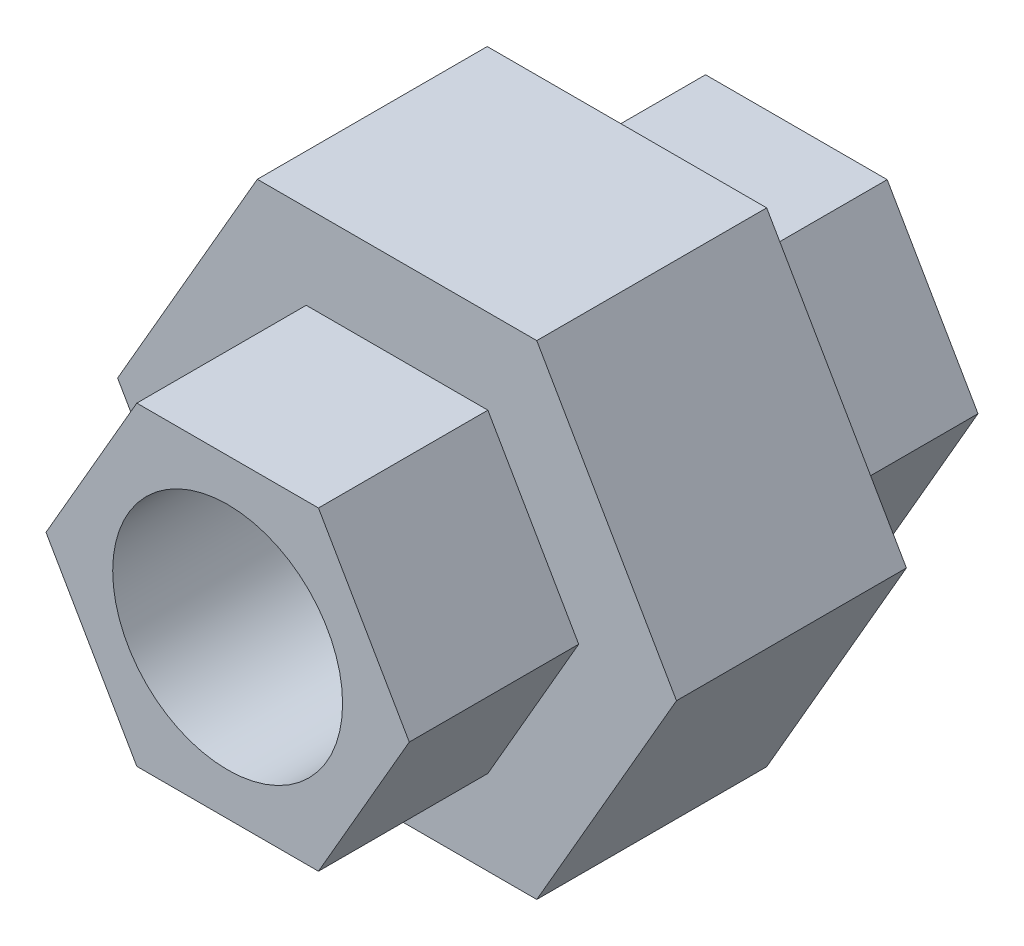
ISO-10303-21;
HEADER;
FILE_DESCRIPTION(('STEP AP214'),'2;1');
FILE_NAME('part.step','',(''),(''),'','','');
FILE_SCHEMA(('AUTOMOTIVE_DESIGN { 1 0 10303 214 1 1 1 1 }'));
ENDSEC;
DATA;
#1=APPLICATION_CONTEXT('core data for automotive mechanical design processes');
#2=APPLICATION_PROTOCOL_DEFINITION('international standard','automotive_design',2000,#1);
#3=PRODUCT_CONTEXT('',#1,'mechanical');
#4=PRODUCT('Part','Part','',(#3));
#5=PRODUCT_RELATED_PRODUCT_CATEGORY('part','',(#4));
#6=PRODUCT_DEFINITION_FORMATION('','',#4);
#7=PRODUCT_DEFINITION_CONTEXT('part definition',#1,'design');
#8=PRODUCT_DEFINITION('design','',#6,#7);
#9=PRODUCT_DEFINITION_SHAPE('','',#8);
#10=(LENGTH_UNIT() NAMED_UNIT(*) SI_UNIT(.MILLI.,.METRE.));
#11=(NAMED_UNIT(*) PLANE_ANGLE_UNIT() SI_UNIT($,.RADIAN.));
#12=(NAMED_UNIT(*) SI_UNIT($,.STERADIAN.) SOLID_ANGLE_UNIT());
#13=UNCERTAINTY_MEASURE_WITH_UNIT(LENGTH_MEASURE(1.E-05),#10,'distance_accuracy_value','');
#14=(GEOMETRIC_REPRESENTATION_CONTEXT(3) GLOBAL_UNCERTAINTY_ASSIGNED_CONTEXT((#13)) GLOBAL_UNIT_ASSIGNED_CONTEXT((#10,
#11,#12)) REPRESENTATION_CONTEXT('',''));
#15=CARTESIAN_POINT('',(0.,0.,0.));
#16=DIRECTION('',(0.,0.,1.));
#17=DIRECTION('',(1.,0.,0.));
#18=AXIS2_PLACEMENT_3D('',#15,#16,#17);
#19=CARTESIAN_POINT('',(-11.5470053837925,-20.,0.));
#20=DIRECTION('',(0.,0.,-1.));
#21=DIRECTION('',(-1.,0.,0.));
#22=AXIS2_PLACEMENT_3D('',#19,#20,#21);
#23=PLANE('',#22);
#24=DIRECTION('',(1.,0.,0.));
#25=VECTOR('',#24,1.);
#26=CARTESIAN_POINT('',(-11.5470053837925,-20.,0.));
#27=LINE('',#26,#25);
#28=CARTESIAN_POINT('',(-11.5470053837925,-20.,0.));
#29=VERTEX_POINT('',#28);
#30=CARTESIAN_POINT('',(11.5470053837925,-20.,0.));
#31=VERTEX_POINT('',#30);
#32=EDGE_CURVE('E243',#29,#31,#27,.T.);
#33=ORIENTED_EDGE('',*,*,#32,.F.);
#34=DIRECTION('',(0.5,-0.866025403784439,0.));
#35=VECTOR('',#34,1.);
#36=CARTESIAN_POINT('',(-23.094010767585,0.,0.));
#37=LINE('',#36,#35);
#38=CARTESIAN_POINT('',(-23.094010767585,0.,0.));
#39=VERTEX_POINT('',#38);
#40=EDGE_CURVE('E248',#39,#29,#37,.T.);
#41=ORIENTED_EDGE('',*,*,#40,.F.);
#42=DIRECTION('',(-0.5,-0.866025403784439,0.));
#43=VECTOR('',#42,1.);
#44=CARTESIAN_POINT('',(-11.5470053837925,20.,0.));
#45=LINE('',#44,#43);
#46=CARTESIAN_POINT('',(-11.5470053837925,20.,0.));
#47=VERTEX_POINT('',#46);
#48=EDGE_CURVE('E267',#47,#39,#45,.T.);
#49=ORIENTED_EDGE('',*,*,#48,.F.);
#50=DIRECTION('',(-1.,0.,0.));
#51=VECTOR('',#50,1.);
#52=CARTESIAN_POINT('',(11.5470053837925,20.,0.));
#53=LINE('',#52,#51);
#54=CARTESIAN_POINT('',(11.5470053837925,20.,0.));
#55=VERTEX_POINT('',#54);
#56=EDGE_CURVE('E265',#55,#47,#53,.T.);
#57=ORIENTED_EDGE('',*,*,#56,.F.);
#58=DIRECTION('',(-0.5,0.866025403784439,0.));
#59=VECTOR('',#58,1.);
#60=CARTESIAN_POINT('',(23.094010767585,0.,0.));
#61=LINE('',#60,#59);
#62=CARTESIAN_POINT('',(23.094010767585,0.,0.));
#63=VERTEX_POINT('',#62);
#64=EDGE_CURVE('E263',#63,#55,#61,.T.);
#65=ORIENTED_EDGE('',*,*,#64,.F.);
#66=DIRECTION('',(0.5,0.866025403784439,0.));
#67=VECTOR('',#66,1.);
#68=CARTESIAN_POINT('',(11.5470053837925,-20.,0.));
#69=LINE('',#68,#67);
#70=EDGE_CURVE('E261',#31,#63,#69,.T.);
#71=ORIENTED_EDGE('',*,*,#70,.F.);
#72=EDGE_LOOP('',(#33,#41,#49,#57,#65,#71));
#73=FACE_BOUND('',#72,.T.);
#74=DIRECTION('',(-0.5,0.866025403784439,0.));
#75=VECTOR('',#74,1.);
#76=CARTESIAN_POINT('',(-7.50555349946513,-13.,0.));
#77=LINE('',#76,#75);
#78=CARTESIAN_POINT('',(-7.50555349946513,-13.,0.));
#79=VERTEX_POINT('',#78);
#80=CARTESIAN_POINT('',(-15.0111069989303,0.,0.));
#81=VERTEX_POINT('',#80);
#82=EDGE_CURVE('E398',#79,#81,#77,.T.);
#83=ORIENTED_EDGE('',*,*,#82,.F.);
#84=DIRECTION('',(-1.,0.,0.));
#85=VECTOR('',#84,1.);
#86=CARTESIAN_POINT('',(7.50555349946514,-13.,0.));
#87=LINE('',#86,#85);
#88=CARTESIAN_POINT('',(7.50555349946514,-13.,0.));
#89=VERTEX_POINT('',#88);
#90=EDGE_CURVE('E190',#89,#79,#87,.T.);
#91=ORIENTED_EDGE('',*,*,#90,.F.);
#92=DIRECTION('',(-0.5,-0.866025403784439,0.));
#93=VECTOR('',#92,1.);
#94=CARTESIAN_POINT('',(15.0111069989303,0.,0.));
#95=LINE('',#94,#93);
#96=CARTESIAN_POINT('',(15.0111069989303,0.,0.));
#97=VERTEX_POINT('',#96);
#98=EDGE_CURVE('E186',#97,#89,#95,.T.);
#99=ORIENTED_EDGE('',*,*,#98,.F.);
#100=DIRECTION('',(0.5,-0.866025403784439,0.));
#101=VECTOR('',#100,1.);
#102=CARTESIAN_POINT('',(7.50555349946513,13.,0.));
#103=LINE('',#102,#101);
#104=CARTESIAN_POINT('',(7.50555349946513,13.,0.));
#105=VERTEX_POINT('',#104);
#106=EDGE_CURVE('E404',#105,#97,#103,.T.);
#107=ORIENTED_EDGE('',*,*,#106,.F.);
#108=DIRECTION('',(1.,0.,0.));
#109=VECTOR('',#108,1.);
#110=CARTESIAN_POINT('',(-7.50555349946514,13.,0.));
#111=LINE('',#110,#109);
#112=CARTESIAN_POINT('',(-7.50555349946514,13.,0.));
#113=VERTEX_POINT('',#112);
#114=EDGE_CURVE('E402',#113,#105,#111,.T.);
#115=ORIENTED_EDGE('',*,*,#114,.F.);
#116=DIRECTION('',(0.5,0.866025403784439,0.));
#117=VECTOR('',#116,1.);
#118=CARTESIAN_POINT('',(-15.0111069989303,0.,0.));
#119=LINE('',#118,#117);
#120=EDGE_CURVE('E400',#81,#113,#119,.T.);
#121=ORIENTED_EDGE('',*,*,#120,.F.);
#122=EDGE_LOOP('',(#83,#91,#99,#107,#115,#121));
#123=FACE_BOUND('',#122,.T.);
#124=ADVANCED_FACE('F42',(#73,#123),#23,.T.);
#125=CARTESIAN_POINT('',(-11.5470053837925,-20.,19.));
#126=DIRECTION('',(0.,0.,-1.));
#127=DIRECTION('',(-1.,0.,0.));
#128=AXIS2_PLACEMENT_3D('',#125,#126,#127);
#129=PLANE('',#128);
#130=DIRECTION('',(1.,0.,0.));
#131=VECTOR('',#130,1.);
#132=CARTESIAN_POINT('',(-11.5470053837925,-20.,19.));
#133=LINE('',#132,#131);
#134=CARTESIAN_POINT('',(-11.5470053837925,-20.,19.));
#135=VERTEX_POINT('',#134);
#136=CARTESIAN_POINT('',(11.5470053837925,-20.,19.));
#137=VERTEX_POINT('',#136);
#138=EDGE_CURVE('E244',#135,#137,#133,.T.);
#139=ORIENTED_EDGE('',*,*,#138,.T.);
#140=DIRECTION('',(0.5,0.866025403784439,0.));
#141=VECTOR('',#140,1.);
#142=CARTESIAN_POINT('',(11.5470053837925,-20.,19.));
#143=LINE('',#142,#141);
#144=CARTESIAN_POINT('',(23.094010767585,0.,19.));
#145=VERTEX_POINT('',#144);
#146=EDGE_CURVE('E247',#137,#145,#143,.T.);
#147=ORIENTED_EDGE('',*,*,#146,.T.);
#148=DIRECTION('',(-0.5,0.866025403784439,0.));
#149=VECTOR('',#148,1.);
#150=CARTESIAN_POINT('',(23.094010767585,0.,19.));
#151=LINE('',#150,#149);
#152=CARTESIAN_POINT('',(11.5470053837925,20.,19.));
#153=VERTEX_POINT('',#152);
#154=EDGE_CURVE('E250',#145,#153,#151,.T.);
#155=ORIENTED_EDGE('',*,*,#154,.T.);
#156=DIRECTION('',(-1.,0.,0.));
#157=VECTOR('',#156,1.);
#158=CARTESIAN_POINT('',(11.5470053837925,20.,19.));
#159=LINE('',#158,#157);
#160=CARTESIAN_POINT('',(-11.5470053837925,20.,19.));
#161=VERTEX_POINT('',#160);
#162=EDGE_CURVE('E252',#153,#161,#159,.T.);
#163=ORIENTED_EDGE('',*,*,#162,.T.);
#164=DIRECTION('',(-0.5,-0.866025403784439,0.));
#165=VECTOR('',#164,1.);
#166=CARTESIAN_POINT('',(-11.5470053837925,20.,19.));
#167=LINE('',#166,#165);
#168=CARTESIAN_POINT('',(-23.094010767585,0.,19.));
#169=VERTEX_POINT('',#168);
#170=EDGE_CURVE('E254',#161,#169,#167,.T.);
#171=ORIENTED_EDGE('',*,*,#170,.T.);
#172=DIRECTION('',(0.5,-0.866025403784439,0.));
#173=VECTOR('',#172,1.);
#174=CARTESIAN_POINT('',(-23.094010767585,0.,19.));
#175=LINE('',#174,#173);
#176=EDGE_CURVE('E256',#169,#135,#175,.T.);
#177=ORIENTED_EDGE('',*,*,#176,.T.);
#178=EDGE_LOOP('',(#139,#147,#155,#163,#171,#177));
#179=FACE_BOUND('',#178,.T.);
#180=DIRECTION('',(1.,0.,0.));
#181=VECTOR('',#180,1.);
#182=CARTESIAN_POINT('',(-7.50555349946514,-13.,19.));
#183=LINE('',#182,#181);
#184=CARTESIAN_POINT('',(-7.50555349946514,-13.,19.));
#185=VERTEX_POINT('',#184);
#186=CARTESIAN_POINT('',(7.50555349946513,-13.,19.));
#187=VERTEX_POINT('',#186);
#188=EDGE_CURVE('E192',#185,#187,#183,.T.);
#189=ORIENTED_EDGE('',*,*,#188,.F.);
#190=DIRECTION('',(0.5,-0.866025403784439,0.));
#191=VECTOR('',#190,1.);
#192=CARTESIAN_POINT('',(-15.0111069989303,0.,19.));
#193=LINE('',#192,#191);
#194=CARTESIAN_POINT('',(-15.0111069989303,0.,19.));
#195=VERTEX_POINT('',#194);
#196=EDGE_CURVE('E204',#195,#185,#193,.T.);
#197=ORIENTED_EDGE('',*,*,#196,.F.);
#198=DIRECTION('',(-0.5,-0.866025403784439,0.));
#199=VECTOR('',#198,1.);
#200=CARTESIAN_POINT('',(-7.50555349946514,13.,19.));
#201=LINE('',#200,#199);
#202=CARTESIAN_POINT('',(-7.50555349946513,13.,19.));
#203=VERTEX_POINT('',#202);
#204=EDGE_CURVE('E222',#203,#195,#201,.T.);
#205=ORIENTED_EDGE('',*,*,#204,.F.);
#206=DIRECTION('',(-1.,0.,0.));
#207=VECTOR('',#206,1.);
#208=CARTESIAN_POINT('',(7.50555349946514,13.,19.));
#209=LINE('',#208,#207);
#210=CARTESIAN_POINT('',(7.50555349946514,13.,19.));
#211=VERTEX_POINT('',#210);
#212=EDGE_CURVE('E219',#211,#203,#209,.T.);
#213=ORIENTED_EDGE('',*,*,#212,.F.);
#214=DIRECTION('',(-0.5,0.866025403784439,0.));
#215=VECTOR('',#214,1.);
#216=CARTESIAN_POINT('',(15.0111069989303,0.,19.));
#217=LINE('',#216,#215);
#218=CARTESIAN_POINT('',(15.0111069989303,0.,19.));
#219=VERTEX_POINT('',#218);
#220=EDGE_CURVE('E216',#219,#211,#217,.T.);
#221=ORIENTED_EDGE('',*,*,#220,.F.);
#222=DIRECTION('',(0.5,0.866025403784439,0.));
#223=VECTOR('',#222,1.);
#224=CARTESIAN_POINT('',(7.50555349946513,-13.,19.));
#225=LINE('',#224,#223);
#226=EDGE_CURVE('E65',#187,#219,#225,.T.);
#227=ORIENTED_EDGE('',*,*,#226,.F.);
#228=EDGE_LOOP('',(#189,#197,#205,#213,#221,#227));
#229=FACE_BOUND('',#228,.T.);
#230=ADVANCED_FACE('F304',(#179,#229),#129,.F.);
#231=CARTESIAN_POINT('',(-11.5470053837925,-20.,19.));
#232=DIRECTION('',(0.,1.,0.));
#233=DIRECTION('',(-1.,0.,0.));
#234=AXIS2_PLACEMENT_3D('',#231,#232,#233);
#235=PLANE('',#234);
#236=ORIENTED_EDGE('',*,*,#32,.T.);
#237=DIRECTION('',(0.,0.,-1.));
#238=VECTOR('',#237,1.);
#239=CARTESIAN_POINT('',(11.5470053837925,-20.,19.));
#240=LINE('',#239,#238);
#241=EDGE_CURVE('E11',#137,#31,#240,.T.);
#242=ORIENTED_EDGE('',*,*,#241,.F.);
#243=ORIENTED_EDGE('',*,*,#138,.F.);
#244=DIRECTION('',(0.,0.,-1.));
#245=VECTOR('',#244,1.);
#246=CARTESIAN_POINT('',(-11.5470053837925,-20.,19.));
#247=LINE('',#246,#245);
#248=EDGE_CURVE('E258',#135,#29,#247,.T.);
#249=ORIENTED_EDGE('',*,*,#248,.T.);
#250=EDGE_LOOP('',(#236,#242,#243,#249));
#251=FACE_BOUND('',#250,.T.);
#252=ADVANCED_FACE('F44',(#251),#235,.F.);
#253=CARTESIAN_POINT('',(11.5470053837925,-20.,19.));
#254=DIRECTION('',(-0.866025403784439,0.5,0.));
#255=DIRECTION('',(-0.5,-0.866025403784439,0.));
#256=AXIS2_PLACEMENT_3D('',#253,#254,#255);
#257=PLANE('',#256);
#258=ORIENTED_EDGE('',*,*,#70,.T.);
#259=DIRECTION('',(0.,0.,-1.));
#260=VECTOR('',#259,1.);
#261=CARTESIAN_POINT('',(23.094010767585,0.,19.));
#262=LINE('',#261,#260);
#263=EDGE_CURVE('E50',#145,#63,#262,.T.);
#264=ORIENTED_EDGE('',*,*,#263,.F.);
#265=ORIENTED_EDGE('',*,*,#146,.F.);
#266=ORIENTED_EDGE('',*,*,#241,.T.);
#267=EDGE_LOOP('',(#258,#264,#265,#266));
#268=FACE_BOUND('',#267,.T.);
#269=ADVANCED_FACE('F308',(#268),#257,.F.);
#270=CARTESIAN_POINT('',(23.094010767585,0.,19.));
#271=DIRECTION('',(-0.866025403784439,-0.5,0.));
#272=DIRECTION('',(0.5,-0.866025403784439,0.));
#273=AXIS2_PLACEMENT_3D('',#270,#271,#272);
#274=PLANE('',#273);
#275=ORIENTED_EDGE('',*,*,#64,.T.);
#276=DIRECTION('',(0.,0.,-1.));
#277=VECTOR('',#276,1.);
#278=CARTESIAN_POINT('',(11.5470053837925,20.,19.));
#279=LINE('',#278,#277);
#280=EDGE_CURVE('E278',#153,#55,#279,.T.);
#281=ORIENTED_EDGE('',*,*,#280,.F.);
#282=ORIENTED_EDGE('',*,*,#154,.F.);
#283=ORIENTED_EDGE('',*,*,#263,.T.);
#284=EDGE_LOOP('',(#275,#281,#282,#283));
#285=FACE_BOUND('',#284,.T.);
#286=ADVANCED_FACE('F285',(#285),#274,.F.);
#287=CARTESIAN_POINT('',(11.5470053837925,20.,19.));
#288=DIRECTION('',(0.,-1.,0.));
#289=DIRECTION('',(1.,0.,0.));
#290=AXIS2_PLACEMENT_3D('',#287,#288,#289);
#291=PLANE('',#290);
#292=ORIENTED_EDGE('',*,*,#56,.T.);
#293=DIRECTION('',(0.,0.,-1.));
#294=VECTOR('',#293,1.);
#295=CARTESIAN_POINT('',(-11.5470053837925,20.,19.));
#296=LINE('',#295,#294);
#297=EDGE_CURVE('E275',#161,#47,#296,.T.);
#298=ORIENTED_EDGE('',*,*,#297,.F.);
#299=ORIENTED_EDGE('',*,*,#162,.F.);
#300=ORIENTED_EDGE('',*,*,#280,.T.);
#301=EDGE_LOOP('',(#292,#298,#299,#300));
#302=FACE_BOUND('',#301,.T.);
#303=ADVANCED_FACE('F296',(#302),#291,.F.);
#304=CARTESIAN_POINT('',(-11.5470053837925,20.,19.));
#305=DIRECTION('',(0.866025403784439,-0.5,0.));
#306=DIRECTION('',(0.5,0.866025403784439,0.));
#307=AXIS2_PLACEMENT_3D('',#304,#305,#306);
#308=PLANE('',#307);
#309=ORIENTED_EDGE('',*,*,#48,.T.);
#310=DIRECTION('',(0.,0.,-1.));
#311=VECTOR('',#310,1.);
#312=CARTESIAN_POINT('',(-23.094010767585,0.,19.));
#313=LINE('',#312,#311);
#314=EDGE_CURVE('E272',#169,#39,#313,.T.);
#315=ORIENTED_EDGE('',*,*,#314,.F.);
#316=ORIENTED_EDGE('',*,*,#170,.F.);
#317=ORIENTED_EDGE('',*,*,#297,.T.);
#318=EDGE_LOOP('',(#309,#315,#316,#317));
#319=FACE_BOUND('',#318,.T.);
#320=ADVANCED_FACE('F300',(#319),#308,.F.);
#321=CARTESIAN_POINT('',(-23.094010767585,0.,19.));
#322=DIRECTION('',(0.866025403784439,0.5,0.));
#323=DIRECTION('',(-0.5,0.866025403784439,0.));
#324=AXIS2_PLACEMENT_3D('',#321,#322,#323);
#325=PLANE('',#324);
#326=ORIENTED_EDGE('',*,*,#40,.T.);
#327=ORIENTED_EDGE('',*,*,#248,.F.);
#328=ORIENTED_EDGE('',*,*,#176,.F.);
#329=ORIENTED_EDGE('',*,*,#314,.T.);
#330=EDGE_LOOP('',(#326,#327,#328,#329));
#331=FACE_BOUND('',#330,.T.);
#332=ADVANCED_FACE('F311',(#331),#325,.F.);
#333=CARTESIAN_POINT('',(-7.50555349946514,-13.,33.));
#334=DIRECTION('',(0.,1.,0.));
#335=DIRECTION('',(-1.,0.,0.));
#336=AXIS2_PLACEMENT_3D('',#333,#334,#335);
#337=PLANE('',#336);
#338=ORIENTED_EDGE('',*,*,#188,.T.);
#339=DIRECTION('',(0.,0.,-1.));
#340=VECTOR('',#339,1.);
#341=CARTESIAN_POINT('',(7.50555349946513,-13.,33.));
#342=LINE('',#341,#340);
#343=CARTESIAN_POINT('',(7.50555349946513,-13.,33.));
#344=VERTEX_POINT('',#343);
#345=EDGE_CURVE('E241',#344,#187,#342,.T.);
#346=ORIENTED_EDGE('',*,*,#345,.F.);
#347=DIRECTION('',(1.,0.,0.));
#348=VECTOR('',#347,1.);
#349=CARTESIAN_POINT('',(-7.50555349946514,-13.,33.));
#350=LINE('',#349,#348);
#351=CARTESIAN_POINT('',(-7.50555349946514,-13.,33.));
#352=VERTEX_POINT('',#351);
#353=EDGE_CURVE('E200',#352,#344,#350,.T.);
#354=ORIENTED_EDGE('',*,*,#353,.F.);
#355=DIRECTION('',(0.,0.,-1.));
#356=VECTOR('',#355,1.);
#357=CARTESIAN_POINT('',(-7.50555349946514,-13.,33.));
#358=LINE('',#357,#356);
#359=EDGE_CURVE('E213',#352,#185,#358,.T.);
#360=ORIENTED_EDGE('',*,*,#359,.T.);
#361=EDGE_LOOP('',(#338,#346,#354,#360));
#362=FACE_BOUND('',#361,.T.);
#363=ADVANCED_FACE('F313',(#362),#337,.F.);
#364=CARTESIAN_POINT('',(7.50555349946513,-13.,33.));
#365=DIRECTION('',(-0.866025403784439,0.5,0.));
#366=DIRECTION('',(-0.5,-0.866025403784439,0.));
#367=AXIS2_PLACEMENT_3D('',#364,#365,#366);
#368=PLANE('',#367);
#369=ORIENTED_EDGE('',*,*,#226,.T.);
#370=DIRECTION('',(0.,0.,-1.));
#371=VECTOR('',#370,1.);
#372=CARTESIAN_POINT('',(15.0111069989303,0.,33.));
#373=LINE('',#372,#371);
#374=CARTESIAN_POINT('',(15.0111069989303,0.,33.));
#375=VERTEX_POINT('',#374);
#376=EDGE_CURVE('E238',#375,#219,#373,.T.);
#377=ORIENTED_EDGE('',*,*,#376,.F.);
#378=DIRECTION('',(0.5,0.866025403784439,0.));
#379=VECTOR('',#378,1.);
#380=CARTESIAN_POINT('',(7.50555349946513,-13.,33.));
#381=LINE('',#380,#379);
#382=EDGE_CURVE('E203',#344,#375,#381,.T.);
#383=ORIENTED_EDGE('',*,*,#382,.F.);
#384=ORIENTED_EDGE('',*,*,#345,.T.);
#385=EDGE_LOOP('',(#369,#377,#383,#384));
#386=FACE_BOUND('',#385,.T.);
#387=ADVANCED_FACE('F319',(#386),#368,.F.);
#388=CARTESIAN_POINT('',(15.0111069989303,0.,33.));
#389=DIRECTION('',(-0.866025403784439,-0.5,0.));
#390=DIRECTION('',(0.5,-0.866025403784439,0.));
#391=AXIS2_PLACEMENT_3D('',#388,#389,#390);
#392=PLANE('',#391);
#393=ORIENTED_EDGE('',*,*,#220,.T.);
#394=DIRECTION('',(0.,0.,-1.));
#395=VECTOR('',#394,1.);
#396=CARTESIAN_POINT('',(7.50555349946514,13.,33.));
#397=LINE('',#396,#395);
#398=CARTESIAN_POINT('',(7.50555349946514,13.,33.));
#399=VERTEX_POINT('',#398);
#400=EDGE_CURVE('E235',#399,#211,#397,.T.);
#401=ORIENTED_EDGE('',*,*,#400,.F.);
#402=DIRECTION('',(-0.5,0.866025403784439,0.));
#403=VECTOR('',#402,1.);
#404=CARTESIAN_POINT('',(15.0111069989303,0.,33.));
#405=LINE('',#404,#403);
#406=EDGE_CURVE('E206',#375,#399,#405,.T.);
#407=ORIENTED_EDGE('',*,*,#406,.F.);
#408=ORIENTED_EDGE('',*,*,#376,.T.);
#409=EDGE_LOOP('',(#393,#401,#407,#408));
#410=FACE_BOUND('',#409,.T.);
#411=ADVANCED_FACE('F332',(#410),#392,.F.);
#412=CARTESIAN_POINT('',(7.50555349946514,13.,33.));
#413=DIRECTION('',(0.,-1.,0.));
#414=DIRECTION('',(1.,0.,0.));
#415=AXIS2_PLACEMENT_3D('',#412,#413,#414);
#416=PLANE('',#415);
#417=ORIENTED_EDGE('',*,*,#212,.T.);
#418=DIRECTION('',(0.,0.,-1.));
#419=VECTOR('',#418,1.);
#420=CARTESIAN_POINT('',(-7.50555349946514,13.,33.));
#421=LINE('',#420,#419);
#422=CARTESIAN_POINT('',(-7.50555349946514,13.,33.));
#423=VERTEX_POINT('',#422);
#424=EDGE_CURVE('E232',#423,#203,#421,.T.);
#425=ORIENTED_EDGE('',*,*,#424,.F.);
#426=DIRECTION('',(-1.,0.,0.));
#427=VECTOR('',#426,1.);
#428=CARTESIAN_POINT('',(7.50555349946514,13.,33.));
#429=LINE('',#428,#427);
#430=EDGE_CURVE('E208',#399,#423,#429,.T.);
#431=ORIENTED_EDGE('',*,*,#430,.F.);
#432=ORIENTED_EDGE('',*,*,#400,.T.);
#433=EDGE_LOOP('',(#417,#425,#431,#432));
#434=FACE_BOUND('',#433,.T.);
#435=ADVANCED_FACE('F336',(#434),#416,.F.);
#436=CARTESIAN_POINT('',(-7.50555349946514,13.,33.));
#437=DIRECTION('',(0.866025403784439,-0.5,0.));
#438=DIRECTION('',(0.5,0.866025403784439,0.));
#439=AXIS2_PLACEMENT_3D('',#436,#437,#438);
#440=PLANE('',#439);
#441=ORIENTED_EDGE('',*,*,#204,.T.);
#442=DIRECTION('',(0.,0.,-1.));
#443=VECTOR('',#442,1.);
#444=CARTESIAN_POINT('',(-15.0111069989303,0.,33.));
#445=LINE('',#444,#443);
#446=CARTESIAN_POINT('',(-15.0111069989303,0.,33.));
#447=VERTEX_POINT('',#446);
#448=EDGE_CURVE('E229',#447,#195,#445,.T.);
#449=ORIENTED_EDGE('',*,*,#448,.F.);
#450=DIRECTION('',(-0.5,-0.866025403784439,0.));
#451=VECTOR('',#450,1.);
#452=CARTESIAN_POINT('',(-7.50555349946514,13.,33.));
#453=LINE('',#452,#451);
#454=EDGE_CURVE('E210',#423,#447,#453,.T.);
#455=ORIENTED_EDGE('',*,*,#454,.F.);
#456=ORIENTED_EDGE('',*,*,#424,.T.);
#457=EDGE_LOOP('',(#441,#449,#455,#456));
#458=FACE_BOUND('',#457,.T.);
#459=ADVANCED_FACE('F340',(#458),#440,.F.);
#460=CARTESIAN_POINT('',(-15.0111069989303,0.,33.));
#461=DIRECTION('',(0.866025403784439,0.5,0.));
#462=DIRECTION('',(-0.5,0.866025403784439,0.));
#463=AXIS2_PLACEMENT_3D('',#460,#461,#462);
#464=PLANE('',#463);
#465=ORIENTED_EDGE('',*,*,#196,.T.);
#466=ORIENTED_EDGE('',*,*,#359,.F.);
#467=DIRECTION('',(0.5,-0.866025403784439,0.));
#468=VECTOR('',#467,1.);
#469=CARTESIAN_POINT('',(-15.0111069989303,0.,33.));
#470=LINE('',#469,#468);
#471=EDGE_CURVE('E212',#447,#352,#470,.T.);
#472=ORIENTED_EDGE('',*,*,#471,.F.);
#473=ORIENTED_EDGE('',*,*,#448,.T.);
#474=EDGE_LOOP('',(#465,#466,#472,#473));
#475=FACE_BOUND('',#474,.T.);
#476=ADVANCED_FACE('F344',(#475),#464,.F.);
#477=CARTESIAN_POINT('',(22.5166604983954,-13.,33.));
#478=DIRECTION('',(0.,0.,1.));
#479=DIRECTION('',(1.,0.,0.));
#480=AXIS2_PLACEMENT_3D('',#477,#478,#479);
#481=PLANE('',#480);
#482=CARTESIAN_POINT('',(0.,0.,33.));
#483=DIRECTION('',(0.,0.,1.));
#484=DIRECTION('',(1.,0.,0.));
#485=AXIS2_PLACEMENT_3D('',#482,#483,#484);
#486=CIRCLE('',#485,9.5);
#487=CARTESIAN_POINT('',(9.5,0.,33.));
#488=VERTEX_POINT('',#487);
#489=EDGE_CURVE('E386',#488,#488,#486,.T.);
#490=ORIENTED_EDGE('',*,*,#489,.F.);
#491=EDGE_LOOP('',(#490));
#492=FACE_BOUND('',#491,.T.);
#493=ORIENTED_EDGE('',*,*,#353,.T.);
#494=ORIENTED_EDGE('',*,*,#382,.T.);
#495=ORIENTED_EDGE('',*,*,#406,.T.);
#496=ORIENTED_EDGE('',*,*,#430,.T.);
#497=ORIENTED_EDGE('',*,*,#454,.T.);
#498=ORIENTED_EDGE('',*,*,#471,.T.);
#499=EDGE_LOOP('',(#493,#494,#495,#496,#497,#498));
#500=FACE_BOUND('',#499,.T.);
#501=ADVANCED_FACE('F348',(#492,#500),#481,.T.);
#502=CARTESIAN_POINT('',(7.50555349946514,-13.,-14.));
#503=DIRECTION('',(0.,1.,0.));
#504=DIRECTION('',(-1.,0.,0.));
#505=AXIS2_PLACEMENT_3D('',#502,#503,#504);
#506=PLANE('',#505);
#507=ORIENTED_EDGE('',*,*,#90,.T.);
#508=DIRECTION('',(0.,0.,1.));
#509=VECTOR('',#508,1.);
#510=CARTESIAN_POINT('',(-7.50555349946513,-13.,-14.));
#511=LINE('',#510,#509);
#512=CARTESIAN_POINT('',(-7.50555349946513,-13.,-14.));
#513=VERTEX_POINT('',#512);
#514=EDGE_CURVE('E171',#513,#79,#511,.T.);
#515=ORIENTED_EDGE('',*,*,#514,.F.);
#516=DIRECTION('',(-1.,0.,0.));
#517=VECTOR('',#516,1.);
#518=CARTESIAN_POINT('',(7.50555349946514,-13.,-14.));
#519=LINE('',#518,#517);
#520=CARTESIAN_POINT('',(7.50555349946514,-13.,-14.));
#521=VERTEX_POINT('',#520);
#522=EDGE_CURVE('E178',#521,#513,#519,.T.);
#523=ORIENTED_EDGE('',*,*,#522,.F.);
#524=DIRECTION('',(0.,0.,1.));
#525=VECTOR('',#524,1.);
#526=CARTESIAN_POINT('',(7.50555349946514,-13.,-14.));
#527=LINE('',#526,#525);
#528=EDGE_CURVE('E396',#521,#89,#527,.T.);
#529=ORIENTED_EDGE('',*,*,#528,.T.);
#530=EDGE_LOOP('',(#507,#515,#523,#529));
#531=FACE_BOUND('',#530,.T.);
#532=ADVANCED_FACE('F188',(#531),#506,.F.);
#533=CARTESIAN_POINT('',(-7.50555349946513,-13.,-14.));
#534=DIRECTION('',(0.866025403784439,0.5,0.));
#535=DIRECTION('',(-0.5,0.866025403784439,0.));
#536=AXIS2_PLACEMENT_3D('',#533,#534,#535);
#537=PLANE('',#536);
#538=ORIENTED_EDGE('',*,*,#82,.T.);
#539=DIRECTION('',(0.,0.,1.));
#540=VECTOR('',#539,1.);
#541=CARTESIAN_POINT('',(-15.0111069989303,0.,-14.));
#542=LINE('',#541,#540);
#543=CARTESIAN_POINT('',(-15.0111069989303,0.,-14.));
#544=VERTEX_POINT('',#543);
#545=EDGE_CURVE('E174',#544,#81,#542,.T.);
#546=ORIENTED_EDGE('',*,*,#545,.F.);
#547=DIRECTION('',(-0.5,0.866025403784439,0.));
#548=VECTOR('',#547,1.);
#549=CARTESIAN_POINT('',(-7.50555349946513,-13.,-14.));
#550=LINE('',#549,#548);
#551=EDGE_CURVE('E167',#513,#544,#550,.T.);
#552=ORIENTED_EDGE('',*,*,#551,.F.);
#553=ORIENTED_EDGE('',*,*,#514,.T.);
#554=EDGE_LOOP('',(#538,#546,#552,#553));
#555=FACE_BOUND('',#554,.T.);
#556=ADVANCED_FACE('F169',(#555),#537,.F.);
#557=CARTESIAN_POINT('',(-15.0111069989303,0.,-14.));
#558=DIRECTION('',(0.866025403784439,-0.5,0.));
#559=DIRECTION('',(0.5,0.866025403784439,0.));
#560=AXIS2_PLACEMENT_3D('',#557,#558,#559);
#561=PLANE('',#560);
#562=ORIENTED_EDGE('',*,*,#120,.T.);
#563=DIRECTION('',(0.,0.,1.));
#564=VECTOR('',#563,1.);
#565=CARTESIAN_POINT('',(-7.50555349946514,13.,-14.));
#566=LINE('',#565,#564);
#567=CARTESIAN_POINT('',(-7.50555349946514,13.,-14.));
#568=VERTEX_POINT('',#567);
#569=EDGE_CURVE('E196',#568,#113,#566,.T.);
#570=ORIENTED_EDGE('',*,*,#569,.F.);
#571=DIRECTION('',(0.5,0.866025403784439,0.));
#572=VECTOR('',#571,1.);
#573=CARTESIAN_POINT('',(-15.0111069989303,0.,-14.));
#574=LINE('',#573,#572);
#575=EDGE_CURVE('E177',#544,#568,#574,.T.);
#576=ORIENTED_EDGE('',*,*,#575,.F.);
#577=ORIENTED_EDGE('',*,*,#545,.T.);
#578=EDGE_LOOP('',(#562,#570,#576,#577));
#579=FACE_BOUND('',#578,.T.);
#580=ADVANCED_FACE('F357',(#579),#561,.F.);
#581=CARTESIAN_POINT('',(-7.50555349946514,13.,-14.));
#582=DIRECTION('',(0.,-1.,0.));
#583=DIRECTION('',(0.,0.,-1.));
#584=AXIS2_PLACEMENT_3D('',#581,#582,#583);
#585=PLANE('',#584);
#586=ORIENTED_EDGE('',*,*,#114,.T.);
#587=DIRECTION('',(0.,0.,1.));
#588=VECTOR('',#587,1.);
#589=CARTESIAN_POINT('',(7.50555349946513,13.,-14.));
#590=LINE('',#589,#588);
#591=CARTESIAN_POINT('',(7.50555349946513,13.,-14.));
#592=VERTEX_POINT('',#591);
#593=EDGE_CURVE('E409',#592,#105,#590,.T.);
#594=ORIENTED_EDGE('',*,*,#593,.F.);
#595=DIRECTION('',(1.,0.,0.));
#596=VECTOR('',#595,1.);
#597=CARTESIAN_POINT('',(-7.50555349946514,13.,-14.));
#598=LINE('',#597,#596);
#599=EDGE_CURVE('E391',#568,#592,#598,.T.);
#600=ORIENTED_EDGE('',*,*,#599,.F.);
#601=ORIENTED_EDGE('',*,*,#569,.T.);
#602=EDGE_LOOP('',(#586,#594,#600,#601));
#603=FACE_BOUND('',#602,.T.);
#604=ADVANCED_FACE('F360',(#603),#585,.F.);
#605=CARTESIAN_POINT('',(7.50555349946513,13.,-14.));
#606=DIRECTION('',(-0.866025403784439,-0.5,0.));
#607=DIRECTION('',(0.5,-0.866025403784439,0.));
#608=AXIS2_PLACEMENT_3D('',#605,#606,#607);
#609=PLANE('',#608);
#610=ORIENTED_EDGE('',*,*,#106,.T.);
#611=DIRECTION('',(0.,0.,1.));
#612=VECTOR('',#611,1.);
#613=CARTESIAN_POINT('',(15.0111069989303,0.,-14.));
#614=LINE('',#613,#612);
#615=CARTESIAN_POINT('',(15.0111069989303,0.,-14.));
#616=VERTEX_POINT('',#615);
#617=EDGE_CURVE('E57',#616,#97,#614,.T.);
#618=ORIENTED_EDGE('',*,*,#617,.F.);
#619=DIRECTION('',(0.5,-0.866025403784439,0.));
#620=VECTOR('',#619,1.);
#621=CARTESIAN_POINT('',(7.50555349946513,13.,-14.));
#622=LINE('',#621,#620);
#623=EDGE_CURVE('E393',#592,#616,#622,.T.);
#624=ORIENTED_EDGE('',*,*,#623,.F.);
#625=ORIENTED_EDGE('',*,*,#593,.T.);
#626=EDGE_LOOP('',(#610,#618,#624,#625));
#627=FACE_BOUND('',#626,.T.);
#628=ADVANCED_FACE('F364',(#627),#609,.F.);
#629=CARTESIAN_POINT('',(15.0111069989303,0.,-14.));
#630=DIRECTION('',(-0.866025403784439,0.5,0.));
#631=DIRECTION('',(-0.5,-0.866025403784439,0.));
#632=AXIS2_PLACEMENT_3D('',#629,#630,#631);
#633=PLANE('',#632);
#634=ORIENTED_EDGE('',*,*,#98,.T.);
#635=ORIENTED_EDGE('',*,*,#528,.F.);
#636=DIRECTION('',(-0.5,-0.866025403784439,0.));
#637=VECTOR('',#636,1.);
#638=CARTESIAN_POINT('',(15.0111069989303,0.,-14.));
#639=LINE('',#638,#637);
#640=EDGE_CURVE('E182',#616,#521,#639,.T.);
#641=ORIENTED_EDGE('',*,*,#640,.F.);
#642=ORIENTED_EDGE('',*,*,#617,.T.);
#643=EDGE_LOOP('',(#634,#635,#641,#642));
#644=FACE_BOUND('',#643,.T.);
#645=ADVANCED_FACE('F368',(#644),#633,.F.);
#646=CARTESIAN_POINT('',(7.50555349946514,-13.,-14.));
#647=DIRECTION('',(0.,0.,1.));
#648=DIRECTION('',(1.,0.,0.));
#649=AXIS2_PLACEMENT_3D('',#646,#647,#648);
#650=PLANE('',#649);
#651=CARTESIAN_POINT('',(0.,0.,-14.));
#652=DIRECTION('',(0.,0.,1.));
#653=DIRECTION('',(1.,0.,0.));
#654=AXIS2_PLACEMENT_3D('',#651,#652,#653);
#655=CIRCLE('',#654,9.5);
#656=CARTESIAN_POINT('',(9.5,0.,-14.));
#657=VERTEX_POINT('',#656);
#658=EDGE_CURVE('E383',#657,#657,#655,.T.);
#659=ORIENTED_EDGE('',*,*,#658,.T.);
#660=EDGE_LOOP('',(#659));
#661=FACE_BOUND('',#660,.T.);
#662=ORIENTED_EDGE('',*,*,#522,.T.);
#663=ORIENTED_EDGE('',*,*,#551,.T.);
#664=ORIENTED_EDGE('',*,*,#575,.T.);
#665=ORIENTED_EDGE('',*,*,#599,.T.);
#666=ORIENTED_EDGE('',*,*,#623,.T.);
#667=ORIENTED_EDGE('',*,*,#640,.T.);
#668=EDGE_LOOP('',(#662,#663,#664,#665,#666,#667));
#669=FACE_BOUND('',#668,.T.);
#670=ADVANCED_FACE('F181',(#661,#669),#650,.F.);
#671=CARTESIAN_POINT('',(0.,0.,-14.));
#672=DIRECTION('',(0.,0.,1.));
#673=DIRECTION('',(1.,0.,0.));
#674=AXIS2_PLACEMENT_3D('',#671,#672,#673);
#675=CYLINDRICAL_SURFACE('',#674,9.5);
#676=ORIENTED_EDGE('',*,*,#658,.F.);
#677=EDGE_LOOP('',(#676));
#678=FACE_BOUND('',#677,.T.);
#679=ORIENTED_EDGE('',*,*,#489,.T.);
#680=EDGE_LOOP('',(#679));
#681=FACE_BOUND('',#680,.T.);
#682=ADVANCED_FACE('F374',(#678,#681),#675,.F.);
#683=CLOSED_SHELL('',(#124,#230,#252,#269,#286,#303,#320,#332,#363,#387,#411,#435,#459,#476,
#501,#532,#556,#580,#604,#628,#645,#670,#682));
#684=MANIFOLD_SOLID_BREP('B2',#683);
#685=ADVANCED_BREP_SHAPE_REPRESENTATION('',(#18,#684),#14);
#686=SHAPE_DEFINITION_REPRESENTATION(#9,#685);
ENDSEC;
END-ISO-10303-21;
